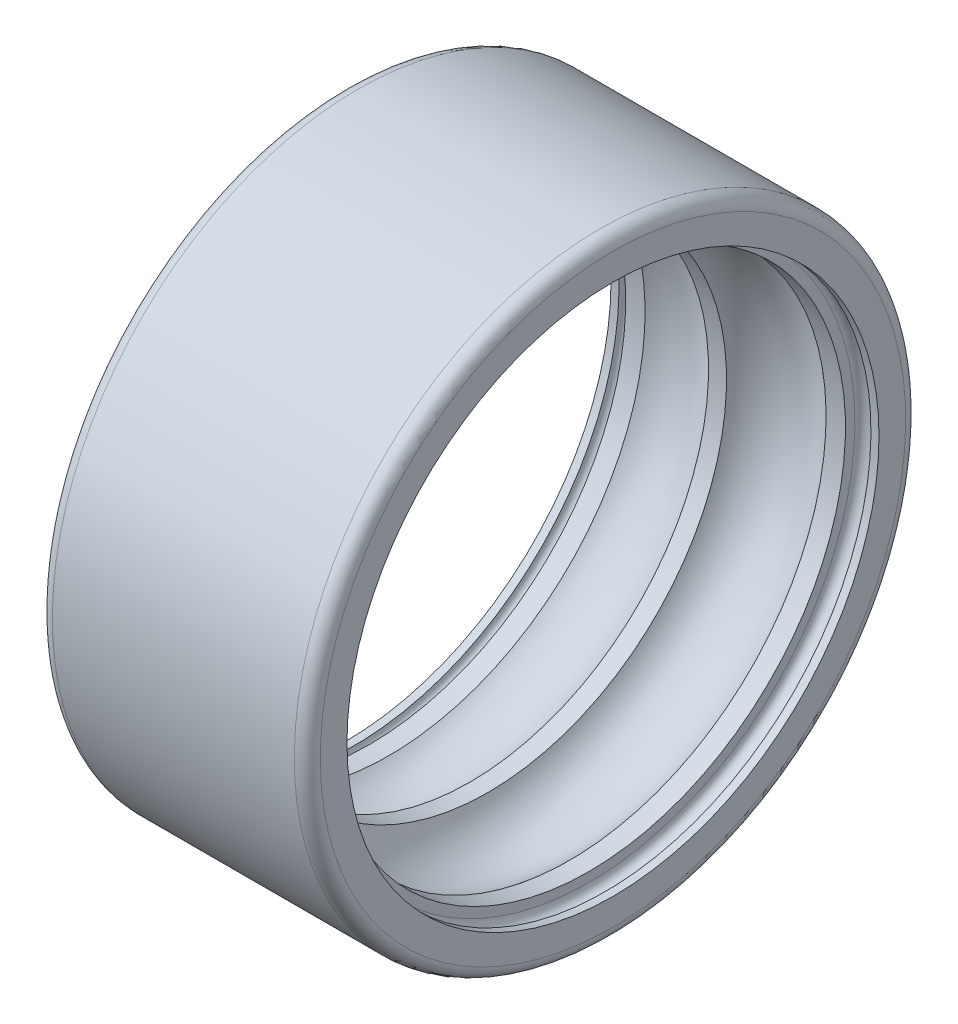
ISO-10303-21;
HEADER;
FILE_DESCRIPTION(('STEP AP214'),'2;1');
FILE_NAME('part.step','',(''),(''),'','','');
FILE_SCHEMA(('AUTOMOTIVE_DESIGN { 1 0 10303 214 1 1 1 1 }'));
ENDSEC;
DATA;
#1=APPLICATION_CONTEXT('core data for automotive mechanical design processes');
#2=APPLICATION_PROTOCOL_DEFINITION('international standard','automotive_design',2000,#1);
#3=PRODUCT_CONTEXT('',#1,'mechanical');
#4=PRODUCT('Part','Part','',(#3));
#5=PRODUCT_RELATED_PRODUCT_CATEGORY('part','',(#4));
#6=PRODUCT_DEFINITION_FORMATION('','',#4);
#7=PRODUCT_DEFINITION_CONTEXT('part definition',#1,'design');
#8=PRODUCT_DEFINITION('design','',#6,#7);
#9=PRODUCT_DEFINITION_SHAPE('','',#8);
#10=(LENGTH_UNIT() NAMED_UNIT(*) SI_UNIT(.MILLI.,.METRE.));
#11=(NAMED_UNIT(*) PLANE_ANGLE_UNIT() SI_UNIT($,.RADIAN.));
#12=(NAMED_UNIT(*) SI_UNIT($,.STERADIAN.) SOLID_ANGLE_UNIT());
#13=UNCERTAINTY_MEASURE_WITH_UNIT(LENGTH_MEASURE(1.E-05),#10,'distance_accuracy_value','');
#14=(GEOMETRIC_REPRESENTATION_CONTEXT(3) GLOBAL_UNCERTAINTY_ASSIGNED_CONTEXT((#13)) GLOBAL_UNIT_ASSIGNED_CONTEXT((#10,
#11,#12)) REPRESENTATION_CONTEXT('',''));
#15=CARTESIAN_POINT('',(0.,0.,0.));
#16=DIRECTION('',(0.,0.,1.));
#17=DIRECTION('',(1.,0.,0.));
#18=AXIS2_PLACEMENT_3D('',#15,#16,#17);
#19=CARTESIAN_POINT('',(19.6,0.,0.));
#20=DIRECTION('',(1.,0.,0.));
#21=DIRECTION('',(0.,0.,-1.));
#22=AXIS2_PLACEMENT_3D('',#19,#20,#21);
#23=TOROIDAL_SURFACE('',#22,22.5,1.);
#24=CARTESIAN_POINT('',(19.6,0.,0.));
#25=DIRECTION('',(1.,0.,0.));
#26=DIRECTION('',(0.,1.,0.));
#27=AXIS2_PLACEMENT_3D('',#24,#25,#26);
#28=CIRCLE('',#27,23.5);
#29=CARTESIAN_POINT('',(19.6,23.5,0.));
#30=VERTEX_POINT('',#29);
#31=EDGE_CURVE('E11',#30,#30,#28,.T.);
#32=ORIENTED_EDGE('',*,*,#31,.T.);
#33=EDGE_LOOP('',(#32));
#34=FACE_BOUND('',#33,.T.);
#35=CARTESIAN_POINT('',(20.6,0.,0.));
#36=DIRECTION('',(1.,0.,0.));
#37=DIRECTION('',(0.,1.,0.));
#38=AXIS2_PLACEMENT_3D('',#35,#36,#37);
#39=CIRCLE('',#38,22.5);
#40=CARTESIAN_POINT('',(20.6,22.5,0.));
#41=VERTEX_POINT('',#40);
#42=EDGE_CURVE('E91',#41,#41,#39,.T.);
#43=ORIENTED_EDGE('',*,*,#42,.F.);
#44=EDGE_LOOP('',(#43));
#45=FACE_BOUND('',#44,.T.);
#46=ADVANCED_FACE('F17',(#34,#45),#23,.T.);
#47=CARTESIAN_POINT('',(10.3,0.,0.));
#48=DIRECTION('',(-1.,0.,0.));
#49=DIRECTION('',(0.,1.,0.));
#50=AXIS2_PLACEMENT_3D('',#47,#48,#49);
#51=CYLINDRICAL_SURFACE('',#50,23.5);
#52=CARTESIAN_POINT('',(1.,0.,0.));
#53=DIRECTION('',(1.,0.,0.));
#54=DIRECTION('',(0.,1.,0.));
#55=AXIS2_PLACEMENT_3D('',#52,#53,#54);
#56=CIRCLE('',#55,23.5);
#57=CARTESIAN_POINT('',(1.,23.5,0.));
#58=VERTEX_POINT('',#57);
#59=EDGE_CURVE('E27',#58,#58,#56,.T.);
#60=ORIENTED_EDGE('',*,*,#59,.T.);
#61=EDGE_LOOP('',(#60));
#62=FACE_BOUND('',#61,.T.);
#63=ORIENTED_EDGE('',*,*,#31,.F.);
#64=EDGE_LOOP('',(#63));
#65=FACE_BOUND('',#64,.T.);
#66=ADVANCED_FACE('F147',(#62,#65),#51,.T.);
#67=CARTESIAN_POINT('',(1.,0.,0.));
#68=DIRECTION('',(1.,0.,0.));
#69=DIRECTION('',(0.,0.,-1.));
#70=AXIS2_PLACEMENT_3D('',#67,#68,#69);
#71=TOROIDAL_SURFACE('',#70,22.5,1.);
#72=CARTESIAN_POINT('',(0.,0.,0.));
#73=DIRECTION('',(1.,0.,0.));
#74=DIRECTION('',(0.,1.,0.));
#75=AXIS2_PLACEMENT_3D('',#72,#73,#74);
#76=CIRCLE('',#75,22.5);
#77=CARTESIAN_POINT('',(0.,22.5,0.));
#78=VERTEX_POINT('',#77);
#79=EDGE_CURVE('E85',#78,#78,#76,.T.);
#80=ORIENTED_EDGE('',*,*,#79,.T.);
#81=EDGE_LOOP('',(#80));
#82=FACE_BOUND('',#81,.T.);
#83=ORIENTED_EDGE('',*,*,#59,.F.);
#84=EDGE_LOOP('',(#83));
#85=FACE_BOUND('',#84,.T.);
#86=ADVANCED_FACE('F86',(#82,#85),#71,.T.);
#87=CARTESIAN_POINT('',(0.,21.1125,0.));
#88=DIRECTION('',(-1.,0.,0.));
#89=DIRECTION('',(0.,-1.,0.));
#90=AXIS2_PLACEMENT_3D('',#87,#88,#89);
#91=PLANE('',#90);
#92=ORIENTED_EDGE('',*,*,#79,.F.);
#93=EDGE_LOOP('',(#92));
#94=FACE_BOUND('',#93,.T.);
#95=CARTESIAN_POINT('',(0.,0.,0.));
#96=DIRECTION('',(1.,0.,0.));
#97=DIRECTION('',(0.,1.,0.));
#98=AXIS2_PLACEMENT_3D('',#95,#96,#97);
#99=CIRCLE('',#98,20.45);
#100=CARTESIAN_POINT('',(0.,-20.45,0.));
#101=VERTEX_POINT('',#100);
#102=EDGE_CURVE('E76',#101,#101,#99,.T.);
#103=ORIENTED_EDGE('',*,*,#102,.T.);
#104=EDGE_LOOP('',(#103));
#105=FACE_BOUND('',#104,.T.);
#106=ADVANCED_FACE('F166',(#94,#105),#91,.T.);
#107=CARTESIAN_POINT('',(1.67169364462025,0.,0.));
#108=DIRECTION('',(-1.,0.,0.));
#109=DIRECTION('',(0.,1.,0.));
#110=AXIS2_PLACEMENT_3D('',#107,#108,#109);
#111=CYLINDRICAL_SURFACE('',#110,19.725);
#112=CARTESIAN_POINT('',(3.3433872892405,0.,0.));
#113=DIRECTION('',(1.,0.,0.));
#114=DIRECTION('',(0.,1.,0.));
#115=AXIS2_PLACEMENT_3D('',#112,#113,#114);
#116=CIRCLE('',#115,19.725);
#117=CARTESIAN_POINT('',(3.3433872892405,19.725,0.));
#118=VERTEX_POINT('',#117);
#119=EDGE_CURVE('E21',#118,#118,#116,.T.);
#120=ORIENTED_EDGE('',*,*,#119,.T.);
#121=EDGE_LOOP('',(#120));
#122=FACE_BOUND('',#121,.T.);
#123=CARTESIAN_POINT('',(1.854,0.,0.));
#124=DIRECTION('',(-1.,0.,0.));
#125=DIRECTION('',(0.,1.,0.));
#126=AXIS2_PLACEMENT_3D('',#123,#124,#125);
#127=CIRCLE('',#126,19.725);
#128=CARTESIAN_POINT('',(1.854,-19.725,0.));
#129=VERTEX_POINT('',#128);
#130=EDGE_CURVE('E96',#129,#129,#127,.T.);
#131=ORIENTED_EDGE('',*,*,#130,.T.);
#132=EDGE_LOOP('',(#131));
#133=FACE_BOUND('',#132,.T.);
#134=ADVANCED_FACE('F169',(#122,#133),#111,.F.);
#135=CARTESIAN_POINT('',(5.97061700892623,0.,0.));
#136=DIRECTION('',(1.,0.,0.));
#137=DIRECTION('',(0.,0.,-1.));
#138=AXIS2_PLACEMENT_3D('',#135,#136,#137);
#139=TOROIDAL_SURFACE('',#138,16.75,3.969);
#140=CARTESIAN_POINT('',(9.60826559558218,0.,0.));
#141=DIRECTION('',(1.,0.,0.));
#142=DIRECTION('',(0.,1.,0.));
#143=AXIS2_PLACEMENT_3D('',#140,#141,#142);
#144=CIRCLE('',#143,18.3376);
#145=CARTESIAN_POINT('',(9.60826559558218,18.3376,0.));
#146=VERTEX_POINT('',#145);
#147=EDGE_CURVE('E65',#146,#146,#144,.T.);
#148=ORIENTED_EDGE('',*,*,#147,.T.);
#149=EDGE_LOOP('',(#148));
#150=FACE_BOUND('',#149,.T.);
#151=ORIENTED_EDGE('',*,*,#119,.F.);
#152=EDGE_LOOP('',(#151));
#153=FACE_BOUND('',#152,.T.);
#154=ADVANCED_FACE('F165',(#150,#153),#139,.F.);
#155=CARTESIAN_POINT('',(10.3,0.,0.));
#156=DIRECTION('',(-1.,0.,0.));
#157=DIRECTION('',(0.,1.,0.));
#158=AXIS2_PLACEMENT_3D('',#155,#156,#157);
#159=CYLINDRICAL_SURFACE('',#158,18.3376);
#160=CARTESIAN_POINT('',(10.9917344044178,0.,0.));
#161=DIRECTION('',(1.,0.,0.));
#162=DIRECTION('',(0.,1.,0.));
#163=AXIS2_PLACEMENT_3D('',#160,#161,#162);
#164=CIRCLE('',#163,18.3376);
#165=CARTESIAN_POINT('',(10.9917344044178,18.3376,0.));
#166=VERTEX_POINT('',#165);
#167=EDGE_CURVE('E59',#166,#166,#164,.T.);
#168=ORIENTED_EDGE('',*,*,#167,.T.);
#169=EDGE_LOOP('',(#168));
#170=FACE_BOUND('',#169,.T.);
#171=ORIENTED_EDGE('',*,*,#147,.F.);
#172=EDGE_LOOP('',(#171));
#173=FACE_BOUND('',#172,.T.);
#174=ADVANCED_FACE('F143',(#170,#173),#159,.F.);
#175=CARTESIAN_POINT('',(14.6293829910738,0.,0.));
#176=DIRECTION('',(1.,0.,0.));
#177=DIRECTION('',(0.,0.,-1.));
#178=AXIS2_PLACEMENT_3D('',#175,#176,#177);
#179=TOROIDAL_SURFACE('',#178,16.75,3.969);
#180=CARTESIAN_POINT('',(17.2566127107595,0.,0.));
#181=DIRECTION('',(1.,0.,0.));
#182=DIRECTION('',(0.,1.,0.));
#183=AXIS2_PLACEMENT_3D('',#180,#181,#182);
#184=CIRCLE('',#183,19.725);
#185=CARTESIAN_POINT('',(17.2566127107595,19.725,0.));
#186=VERTEX_POINT('',#185);
#187=EDGE_CURVE('E93',#186,#186,#184,.T.);
#188=ORIENTED_EDGE('',*,*,#187,.T.);
#189=EDGE_LOOP('',(#188));
#190=FACE_BOUND('',#189,.T.);
#191=ORIENTED_EDGE('',*,*,#167,.F.);
#192=EDGE_LOOP('',(#191));
#193=FACE_BOUND('',#192,.T.);
#194=ADVANCED_FACE('F19',(#190,#193),#179,.F.);
#195=CARTESIAN_POINT('',(18.9283063553797,0.,0.));
#196=DIRECTION('',(-1.,0.,0.));
#197=DIRECTION('',(0.,1.,0.));
#198=AXIS2_PLACEMENT_3D('',#195,#196,#197);
#199=CYLINDRICAL_SURFACE('',#198,19.725);
#200=ORIENTED_EDGE('',*,*,#187,.F.);
#201=EDGE_LOOP('',(#200));
#202=FACE_BOUND('',#201,.T.);
#203=CARTESIAN_POINT('',(18.746,0.,0.));
#204=DIRECTION('',(1.,0.,0.));
#205=DIRECTION('',(0.,1.,0.));
#206=AXIS2_PLACEMENT_3D('',#203,#204,#205);
#207=CIRCLE('',#206,19.725);
#208=CARTESIAN_POINT('',(18.746,-19.725,0.));
#209=VERTEX_POINT('',#208);
#210=EDGE_CURVE('E102',#209,#209,#207,.T.);
#211=ORIENTED_EDGE('',*,*,#210,.T.);
#212=EDGE_LOOP('',(#211));
#213=FACE_BOUND('',#212,.T.);
#214=ADVANCED_FACE('F131',(#202,#213),#199,.F.);
#215=CARTESIAN_POINT('',(20.6,21.1125,0.));
#216=DIRECTION('',(1.,0.,0.));
#217=DIRECTION('',(0.,1.,0.));
#218=AXIS2_PLACEMENT_3D('',#215,#216,#217);
#219=PLANE('',#218);
#220=ORIENTED_EDGE('',*,*,#42,.T.);
#221=EDGE_LOOP('',(#220));
#222=FACE_BOUND('',#221,.T.);
#223=CARTESIAN_POINT('',(20.6,0.,0.));
#224=DIRECTION('',(-1.,0.,0.));
#225=DIRECTION('',(0.,1.,0.));
#226=AXIS2_PLACEMENT_3D('',#223,#224,#225);
#227=CIRCLE('',#226,20.45);
#228=CARTESIAN_POINT('',(20.6,-20.45,0.));
#229=VERTEX_POINT('',#228);
#230=EDGE_CURVE('E101',#229,#229,#227,.T.);
#231=ORIENTED_EDGE('',*,*,#230,.T.);
#232=EDGE_LOOP('',(#231));
#233=FACE_BOUND('',#232,.T.);
#234=ADVANCED_FACE('F133',(#222,#233),#219,.T.);
#235=CARTESIAN_POINT('',(1.236,0.,0.));
#236=DIRECTION('',(1.,0.,0.));
#237=DIRECTION('',(0.,0.,-1.));
#238=AXIS2_PLACEMENT_3D('',#235,#236,#237);
#239=TOROIDAL_SURFACE('',#238,20.45,0.618);
#240=CARTESIAN_POINT('',(0.618,0.,0.));
#241=DIRECTION('',(1.,0.,0.));
#242=DIRECTION('',(0.,1.,0.));
#243=AXIS2_PLACEMENT_3D('',#240,#241,#242);
#244=CIRCLE('',#243,20.45);
#245=CARTESIAN_POINT('',(0.618,20.45,0.));
#246=VERTEX_POINT('',#245);
#247=EDGE_CURVE('E94',#246,#246,#244,.T.);
#248=ORIENTED_EDGE('',*,*,#247,.F.);
#249=EDGE_LOOP('',(#248));
#250=FACE_BOUND('',#249,.T.);
#251=CARTESIAN_POINT('',(1.854,0.,0.));
#252=DIRECTION('',(1.,0.,0.));
#253=DIRECTION('',(0.,1.,0.));
#254=AXIS2_PLACEMENT_3D('',#251,#252,#253);
#255=CIRCLE('',#254,20.45);
#256=CARTESIAN_POINT('',(1.854,20.45,0.));
#257=VERTEX_POINT('',#256);
#258=EDGE_CURVE('E81',#257,#257,#255,.T.);
#259=ORIENTED_EDGE('',*,*,#258,.T.);
#260=EDGE_LOOP('',(#259));
#261=FACE_BOUND('',#260,.T.);
#262=ADVANCED_FACE('F140',(#250,#261),#239,.F.);
#263=CARTESIAN_POINT('',(-0.191,0.,0.));
#264=DIRECTION('',(-1.,0.,0.));
#265=DIRECTION('',(0.,1.,0.));
#266=AXIS2_PLACEMENT_3D('',#263,#264,#265);
#267=CYLINDRICAL_SURFACE('',#266,20.45);
#268=ORIENTED_EDGE('',*,*,#247,.T.);
#269=EDGE_LOOP('',(#268));
#270=FACE_BOUND('',#269,.T.);
#271=ORIENTED_EDGE('',*,*,#102,.F.);
#272=EDGE_LOOP('',(#271));
#273=FACE_BOUND('',#272,.T.);
#274=ADVANCED_FACE('F158',(#270,#273),#267,.F.);
#275=CARTESIAN_POINT('',(1.854,19.5875,0.));
#276=DIRECTION('',(1.,0.,0.));
#277=DIRECTION('',(0.,1.,0.));
#278=AXIS2_PLACEMENT_3D('',#275,#276,#277);
#279=PLANE('',#278);
#280=ORIENTED_EDGE('',*,*,#258,.F.);
#281=EDGE_LOOP('',(#280));
#282=FACE_BOUND('',#281,.T.);
#283=ORIENTED_EDGE('',*,*,#130,.F.);
#284=EDGE_LOOP('',(#283));
#285=FACE_BOUND('',#284,.T.);
#286=ADVANCED_FACE('F121',(#282,#285),#279,.F.);
#287=CARTESIAN_POINT('',(19.364,0.,0.));
#288=DIRECTION('',(-1.,0.,0.));
#289=DIRECTION('',(0.,0.,1.));
#290=AXIS2_PLACEMENT_3D('',#287,#288,#289);
#291=TOROIDAL_SURFACE('',#290,20.45,0.618);
#292=CARTESIAN_POINT('',(19.982,0.,0.));
#293=DIRECTION('',(-1.,0.,0.));
#294=DIRECTION('',(0.,1.,0.));
#295=AXIS2_PLACEMENT_3D('',#292,#293,#294);
#296=CIRCLE('',#295,20.45);
#297=CARTESIAN_POINT('',(19.982,20.45,0.));
#298=VERTEX_POINT('',#297);
#299=EDGE_CURVE('E106',#298,#298,#296,.T.);
#300=ORIENTED_EDGE('',*,*,#299,.F.);
#301=EDGE_LOOP('',(#300));
#302=FACE_BOUND('',#301,.T.);
#303=CARTESIAN_POINT('',(18.746,0.,0.));
#304=DIRECTION('',(-1.,0.,0.));
#305=DIRECTION('',(0.,1.,0.));
#306=AXIS2_PLACEMENT_3D('',#303,#304,#305);
#307=CIRCLE('',#306,20.45);
#308=CARTESIAN_POINT('',(18.746,20.45,0.));
#309=VERTEX_POINT('',#308);
#310=EDGE_CURVE('E98',#309,#309,#307,.T.);
#311=ORIENTED_EDGE('',*,*,#310,.T.);
#312=EDGE_LOOP('',(#311));
#313=FACE_BOUND('',#312,.T.);
#314=ADVANCED_FACE('F118',(#302,#313),#291,.F.);
#315=CARTESIAN_POINT('',(20.791,0.,0.));
#316=DIRECTION('',(1.,0.,0.));
#317=DIRECTION('',(0.,1.,0.));
#318=AXIS2_PLACEMENT_3D('',#315,#316,#317);
#319=CYLINDRICAL_SURFACE('',#318,20.45);
#320=ORIENTED_EDGE('',*,*,#299,.T.);
#321=EDGE_LOOP('',(#320));
#322=FACE_BOUND('',#321,.T.);
#323=ORIENTED_EDGE('',*,*,#230,.F.);
#324=EDGE_LOOP('',(#323));
#325=FACE_BOUND('',#324,.T.);
#326=ADVANCED_FACE('F115',(#322,#325),#319,.F.);
#327=CARTESIAN_POINT('',(18.746,19.5875,0.));
#328=DIRECTION('',(-1.,0.,0.));
#329=DIRECTION('',(0.,1.,0.));
#330=AXIS2_PLACEMENT_3D('',#327,#328,#329);
#331=PLANE('',#330);
#332=ORIENTED_EDGE('',*,*,#310,.F.);
#333=EDGE_LOOP('',(#332));
#334=FACE_BOUND('',#333,.T.);
#335=ORIENTED_EDGE('',*,*,#210,.F.);
#336=EDGE_LOOP('',(#335));
#337=FACE_BOUND('',#336,.T.);
#338=ADVANCED_FACE('F125',(#334,#337),#331,.F.);
#339=CLOSED_SHELL('',(#46,#66,#86,#106,#134,#154,#174,#194,#214,#234,#262,#274,#286,#314,#326,#338));
#340=MANIFOLD_SOLID_BREP('B1',#339);
#341=ADVANCED_BREP_SHAPE_REPRESENTATION('',(#18,#340),#14);
#342=SHAPE_DEFINITION_REPRESENTATION(#9,#341);
ENDSEC;
END-ISO-10303-21;
